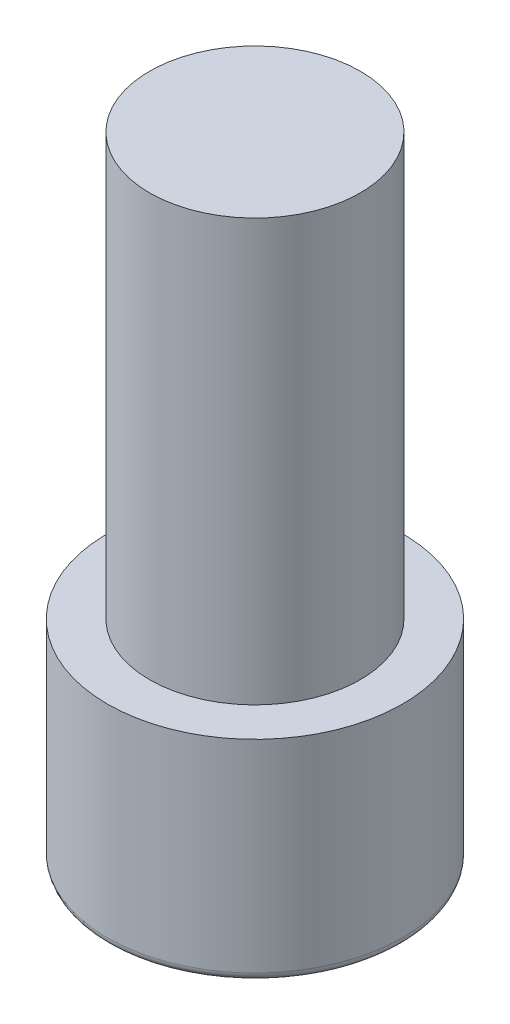
ISO-10303-21;
HEADER;
FILE_DESCRIPTION(('STEP AP214'),'2;1');
FILE_NAME('part.step','',(''),(''),'','','');
FILE_SCHEMA(('AUTOMOTIVE_DESIGN { 1 0 10303 214 1 1 1 1 }'));
ENDSEC;
DATA;
#1=APPLICATION_CONTEXT('core data for automotive mechanical design processes');
#2=APPLICATION_PROTOCOL_DEFINITION('international standard','automotive_design',2000,#1);
#3=PRODUCT_CONTEXT('',#1,'mechanical');
#4=PRODUCT('Part','Part','',(#3));
#5=PRODUCT_RELATED_PRODUCT_CATEGORY('part','',(#4));
#6=PRODUCT_DEFINITION_FORMATION('','',#4);
#7=PRODUCT_DEFINITION_CONTEXT('part definition',#1,'design');
#8=PRODUCT_DEFINITION('design','',#6,#7);
#9=PRODUCT_DEFINITION_SHAPE('','',#8);
#10=(LENGTH_UNIT() NAMED_UNIT(*) SI_UNIT(.MILLI.,.METRE.));
#11=(NAMED_UNIT(*) PLANE_ANGLE_UNIT() SI_UNIT($,.RADIAN.));
#12=(NAMED_UNIT(*) SI_UNIT($,.STERADIAN.) SOLID_ANGLE_UNIT());
#13=UNCERTAINTY_MEASURE_WITH_UNIT(LENGTH_MEASURE(1.E-05),#10,'distance_accuracy_value','');
#14=(GEOMETRIC_REPRESENTATION_CONTEXT(3) GLOBAL_UNCERTAINTY_ASSIGNED_CONTEXT((#13)) GLOBAL_UNIT_ASSIGNED_CONTEXT((#10,
#11,#12)) REPRESENTATION_CONTEXT('',''));
#15=CARTESIAN_POINT('',(0.,0.,0.));
#16=DIRECTION('',(0.,0.,1.));
#17=DIRECTION('',(1.,0.,0.));
#18=AXIS2_PLACEMENT_3D('',#15,#16,#17);
#19=CARTESIAN_POINT('',(0.,5.,0.));
#20=DIRECTION('',(0.,-1.,0.));
#21=DIRECTION('',(0.,0.,-1.));
#22=AXIS2_PLACEMENT_3D('',#19,#20,#21);
#23=CYLINDRICAL_SURFACE('',#22,3.5);
#24=CARTESIAN_POINT('',(0.,0.2,0.));
#25=DIRECTION('',(0.,1.,0.));
#26=DIRECTION('',(0.,0.,1.));
#27=AXIS2_PLACEMENT_3D('',#24,#25,#26);
#28=CIRCLE('',#27,3.5);
#29=CARTESIAN_POINT('',(0.,0.2,3.5));
#30=VERTEX_POINT('',#29);
#31=EDGE_CURVE('E50',#30,#30,#28,.T.);
#32=ORIENTED_EDGE('',*,*,#31,.T.);
#33=EDGE_LOOP('',(#32));
#34=FACE_BOUND('',#33,.T.);
#35=CARTESIAN_POINT('',(0.,5.,0.));
#36=DIRECTION('',(0.,1.,0.));
#37=DIRECTION('',(0.,0.,1.));
#38=AXIS2_PLACEMENT_3D('',#35,#36,#37);
#39=CIRCLE('',#38,3.5);
#40=CARTESIAN_POINT('',(0.,5.,3.5));
#41=VERTEX_POINT('',#40);
#42=EDGE_CURVE('E174',#41,#41,#39,.T.);
#43=ORIENTED_EDGE('',*,*,#42,.F.);
#44=EDGE_LOOP('',(#43));
#45=FACE_BOUND('',#44,.T.);
#46=ADVANCED_FACE('F41',(#34,#45),#23,.T.);
#47=CARTESIAN_POINT('',(0.,5.,0.));
#48=DIRECTION('',(0.,1.,0.));
#49=DIRECTION('',(0.,0.,1.));
#50=AXIS2_PLACEMENT_3D('',#47,#48,#49);
#51=PLANE('',#50);
#52=CARTESIAN_POINT('',(0.,5.,0.));
#53=DIRECTION('',(0.,1.,0.));
#54=DIRECTION('',(0.,0.,1.));
#55=AXIS2_PLACEMENT_3D('',#52,#53,#54);
#56=CIRCLE('',#55,2.5);
#57=CARTESIAN_POINT('',(0.,5.,2.5));
#58=VERTEX_POINT('',#57);
#59=EDGE_CURVE('E175',#58,#58,#56,.T.);
#60=ORIENTED_EDGE('',*,*,#59,.F.);
#61=EDGE_LOOP('',(#60));
#62=FACE_BOUND('',#61,.T.);
#63=ORIENTED_EDGE('',*,*,#42,.T.);
#64=EDGE_LOOP('',(#63));
#65=FACE_BOUND('',#64,.T.);
#66=ADVANCED_FACE('F251',(#62,#65),#51,.T.);
#67=CARTESIAN_POINT('',(0.,0.,0.));
#68=DIRECTION('',(0.,1.,0.));
#69=DIRECTION('',(0.,0.,1.));
#70=AXIS2_PLACEMENT_3D('',#67,#68,#69);
#71=PLANE('',#70);
#72=CARTESIAN_POINT('',(0.,0.,0.));
#73=DIRECTION('',(0.,1.,0.));
#74=DIRECTION('',(0.,0.,1.));
#75=AXIS2_PLACEMENT_3D('',#72,#73,#74);
#76=CIRCLE('',#75,3.3);
#77=CARTESIAN_POINT('',(0.,0.,3.3));
#78=VERTEX_POINT('',#77);
#79=EDGE_CURVE('E11',#78,#78,#76,.F.);
#80=ORIENTED_EDGE('',*,*,#79,.T.);
#81=EDGE_LOOP('',(#80));
#82=FACE_BOUND('',#81,.T.);
#83=DIRECTION('',(0.866025403784439,0.,-0.5));
#84=VECTOR('',#83,1.);
#85=CARTESIAN_POINT('',(0.991025403784438,0.,1.71650635094611));
#86=LINE('',#85,#84);
#87=CARTESIAN_POINT('',(0.,0.,2.28867513459481));
#88=VERTEX_POINT('',#87);
#89=CARTESIAN_POINT('',(1.98205080756888,0.,1.14433756729741));
#90=VERTEX_POINT('',#89);
#91=EDGE_CURVE('E186',#88,#90,#86,.T.);
#92=ORIENTED_EDGE('',*,*,#91,.T.);
#93=DIRECTION('',(0.,0.,-1.));
#94=VECTOR('',#93,1.);
#95=CARTESIAN_POINT('',(1.98205080756888,0.,0.));
#96=LINE('',#95,#94);
#97=CARTESIAN_POINT('',(1.98205080756888,0.,-1.14433756729741));
#98=VERTEX_POINT('',#97);
#99=EDGE_CURVE('E201',#90,#98,#96,.T.);
#100=ORIENTED_EDGE('',*,*,#99,.T.);
#101=DIRECTION('',(-0.866025403784439,0.,-0.5));
#102=VECTOR('',#101,1.);
#103=CARTESIAN_POINT('',(0.991025403784439,0.,-1.71650635094611));
#104=LINE('',#103,#102);
#105=CARTESIAN_POINT('',(0.,0.,-2.28867513459481));
#106=VERTEX_POINT('',#105);
#107=EDGE_CURVE('E198',#98,#106,#104,.T.);
#108=ORIENTED_EDGE('',*,*,#107,.T.);
#109=DIRECTION('',(-0.866025403784439,0.,0.5));
#110=VECTOR('',#109,1.);
#111=CARTESIAN_POINT('',(-0.991025403784439,0.,-1.71650635094611));
#112=LINE('',#111,#110);
#113=CARTESIAN_POINT('',(-1.98205080756888,0.,-1.14433756729741));
#114=VERTEX_POINT('',#113);
#115=EDGE_CURVE('E195',#106,#114,#112,.T.);
#116=ORIENTED_EDGE('',*,*,#115,.T.);
#117=DIRECTION('',(0.,0.,1.));
#118=VECTOR('',#117,1.);
#119=CARTESIAN_POINT('',(-1.98205080756888,0.,0.));
#120=LINE('',#119,#118);
#121=CARTESIAN_POINT('',(-1.98205080756888,0.,1.14433756729741));
#122=VERTEX_POINT('',#121);
#123=EDGE_CURVE('E192',#114,#122,#120,.T.);
#124=ORIENTED_EDGE('',*,*,#123,.T.);
#125=DIRECTION('',(0.866025403784439,0.,0.5));
#126=VECTOR('',#125,1.);
#127=CARTESIAN_POINT('',(-0.991025403784439,0.,1.71650635094611));
#128=LINE('',#127,#126);
#129=EDGE_CURVE('E189',#122,#88,#128,.T.);
#130=ORIENTED_EDGE('',*,*,#129,.T.);
#131=EDGE_LOOP('',(#92,#100,#108,#116,#124,#130));
#132=FACE_BOUND('',#131,.T.);
#133=ADVANCED_FACE('F256',(#82,#132),#71,.F.);
#134=CARTESIAN_POINT('',(0.,15.,0.));
#135=DIRECTION('',(0.,-1.,0.));
#136=DIRECTION('',(0.,0.,-1.));
#137=AXIS2_PLACEMENT_3D('',#134,#135,#136);
#138=CYLINDRICAL_SURFACE('',#137,2.5);
#139=CARTESIAN_POINT('',(0.,15.,0.));
#140=DIRECTION('',(0.,1.,0.));
#141=DIRECTION('',(0.,0.,1.));
#142=AXIS2_PLACEMENT_3D('',#139,#140,#141);
#143=CIRCLE('',#142,2.5);
#144=CARTESIAN_POINT('',(0.,15.,2.5));
#145=VERTEX_POINT('',#144);
#146=EDGE_CURVE('E156',#145,#145,#143,.T.);
#147=ORIENTED_EDGE('',*,*,#146,.F.);
#148=EDGE_LOOP('',(#147));
#149=FACE_BOUND('',#148,.T.);
#150=ORIENTED_EDGE('',*,*,#59,.T.);
#151=EDGE_LOOP('',(#150));
#152=FACE_BOUND('',#151,.T.);
#153=ADVANCED_FACE('F344',(#149,#152),#138,.T.);
#154=CARTESIAN_POINT('',(0.,15.,0.));
#155=DIRECTION('',(0.,1.,0.));
#156=DIRECTION('',(0.,0.,1.));
#157=AXIS2_PLACEMENT_3D('',#154,#155,#156);
#158=PLANE('',#157);
#159=ORIENTED_EDGE('',*,*,#146,.T.);
#160=EDGE_LOOP('',(#159));
#161=FACE_BOUND('',#160,.T.);
#162=ADVANCED_FACE('F330',(#161),#158,.T.);
#163=CARTESIAN_POINT('',(1.73205080756888,2.,1.));
#164=DIRECTION('',(0.5,0.,0.866025403784439));
#165=DIRECTION('',(0.866025403784439,0.,-0.5));
#166=AXIS2_PLACEMENT_3D('',#163,#164,#165);
#167=PLANE('',#166);
#168=DIRECTION('',(0.,-1.,0.));
#169=VECTOR('',#168,1.);
#170=CARTESIAN_POINT('',(1.73205080756888,2.,1.));
#171=LINE('',#170,#169);
#172=CARTESIAN_POINT('',(1.73205080756888,2.,1.));
#173=VERTEX_POINT('',#172);
#174=CARTESIAN_POINT('',(1.73205080756888,0.249999999999999,1.));
#175=VERTEX_POINT('',#174);
#176=EDGE_CURVE('E153',#173,#175,#171,.T.);
#177=ORIENTED_EDGE('',*,*,#176,.T.);
#178=DIRECTION('',(-0.866025403784439,0.,0.5));
#179=VECTOR('',#178,1.);
#180=CARTESIAN_POINT('',(1.73205080756888,0.249999999999999,1.));
#181=LINE('',#180,#179);
#182=CARTESIAN_POINT('',(0.,0.249999999999999,2.));
#183=VERTEX_POINT('',#182);
#184=EDGE_CURVE('E57',#175,#183,#181,.T.);
#185=ORIENTED_EDGE('',*,*,#184,.T.);
#186=DIRECTION('',(0.,-1.,0.));
#187=VECTOR('',#186,1.);
#188=CARTESIAN_POINT('',(0.,2.,2.));
#189=LINE('',#188,#187);
#190=CARTESIAN_POINT('',(0.,2.,2.));
#191=VERTEX_POINT('',#190);
#192=EDGE_CURVE('E112',#191,#183,#189,.T.);
#193=ORIENTED_EDGE('',*,*,#192,.F.);
#194=DIRECTION('',(-0.866025403784439,0.,0.5));
#195=VECTOR('',#194,1.);
#196=CARTESIAN_POINT('',(1.73205080756888,2.,1.));
#197=LINE('',#196,#195);
#198=EDGE_CURVE('E116',#173,#191,#197,.T.);
#199=ORIENTED_EDGE('',*,*,#198,.F.);
#200=EDGE_LOOP('',(#177,#185,#193,#199));
#201=FACE_BOUND('',#200,.T.);
#202=ADVANCED_FACE('F114',(#201),#167,.F.);
#203=CARTESIAN_POINT('',(1.73205080756888,2.,-1.));
#204=DIRECTION('',(1.,0.,0.));
#205=DIRECTION('',(0.,0.,-1.));
#206=AXIS2_PLACEMENT_3D('',#203,#204,#205);
#207=PLANE('',#206);
#208=DIRECTION('',(0.,-1.,0.));
#209=VECTOR('',#208,1.);
#210=CARTESIAN_POINT('',(1.73205080756888,2.,-1.));
#211=LINE('',#210,#209);
#212=CARTESIAN_POINT('',(1.73205080756888,2.,-1.));
#213=VERTEX_POINT('',#212);
#214=CARTESIAN_POINT('',(1.73205080756888,0.249999999999999,-1.));
#215=VERTEX_POINT('',#214);
#216=EDGE_CURVE('E157',#213,#215,#211,.T.);
#217=ORIENTED_EDGE('',*,*,#216,.T.);
#218=DIRECTION('',(0.,0.,1.));
#219=VECTOR('',#218,1.);
#220=CARTESIAN_POINT('',(1.73205080756888,0.249999999999999,-1.));
#221=LINE('',#220,#219);
#222=EDGE_CURVE('E179',#215,#175,#221,.T.);
#223=ORIENTED_EDGE('',*,*,#222,.T.);
#224=ORIENTED_EDGE('',*,*,#176,.F.);
#225=DIRECTION('',(0.,0.,1.));
#226=VECTOR('',#225,1.);
#227=CARTESIAN_POINT('',(1.73205080756888,2.,-1.));
#228=LINE('',#227,#226);
#229=EDGE_CURVE('E120',#213,#173,#228,.T.);
#230=ORIENTED_EDGE('',*,*,#229,.F.);
#231=EDGE_LOOP('',(#217,#223,#224,#230));
#232=FACE_BOUND('',#231,.T.);
#233=ADVANCED_FACE('F320',(#232),#207,.F.);
#234=CARTESIAN_POINT('',(0.,2.,-2.));
#235=DIRECTION('',(0.5,0.,-0.866025403784439));
#236=DIRECTION('',(-0.866025403784439,0.,-0.5));
#237=AXIS2_PLACEMENT_3D('',#234,#235,#236);
#238=PLANE('',#237);
#239=DIRECTION('',(0.,-1.,0.));
#240=VECTOR('',#239,1.);
#241=CARTESIAN_POINT('',(0.,2.,-2.));
#242=LINE('',#241,#240);
#243=CARTESIAN_POINT('',(0.,2.,-2.));
#244=VERTEX_POINT('',#243);
#245=CARTESIAN_POINT('',(0.,0.249999999999999,-2.));
#246=VERTEX_POINT('',#245);
#247=EDGE_CURVE('E161',#244,#246,#242,.T.);
#248=ORIENTED_EDGE('',*,*,#247,.T.);
#249=DIRECTION('',(0.866025403784439,0.,0.5));
#250=VECTOR('',#249,1.);
#251=CARTESIAN_POINT('',(0.,0.249999999999999,-2.));
#252=LINE('',#251,#250);
#253=EDGE_CURVE('E205',#246,#215,#252,.T.);
#254=ORIENTED_EDGE('',*,*,#253,.T.);
#255=ORIENTED_EDGE('',*,*,#216,.F.);
#256=DIRECTION('',(0.866025403784439,0.,0.5));
#257=VECTOR('',#256,1.);
#258=CARTESIAN_POINT('',(0.,2.,-2.));
#259=LINE('',#258,#257);
#260=EDGE_CURVE('E148',#244,#213,#259,.T.);
#261=ORIENTED_EDGE('',*,*,#260,.F.);
#262=EDGE_LOOP('',(#248,#254,#255,#261));
#263=FACE_BOUND('',#262,.T.);
#264=ADVANCED_FACE('F317',(#263),#238,.F.);
#265=CARTESIAN_POINT('',(-1.73205080756888,2.,-1.));
#266=DIRECTION('',(-0.5,0.,-0.866025403784439));
#267=DIRECTION('',(-0.866025403784439,0.,0.5));
#268=AXIS2_PLACEMENT_3D('',#265,#266,#267);
#269=PLANE('',#268);
#270=DIRECTION('',(0.,-1.,0.));
#271=VECTOR('',#270,1.);
#272=CARTESIAN_POINT('',(-1.73205080756888,2.,-1.));
#273=LINE('',#272,#271);
#274=CARTESIAN_POINT('',(-1.73205080756888,2.,-1.));
#275=VERTEX_POINT('',#274);
#276=CARTESIAN_POINT('',(-1.73205080756888,0.249999999999999,-1.));
#277=VERTEX_POINT('',#276);
#278=EDGE_CURVE('E165',#275,#277,#273,.T.);
#279=ORIENTED_EDGE('',*,*,#278,.T.);
#280=DIRECTION('',(0.866025403784439,0.,-0.5));
#281=VECTOR('',#280,1.);
#282=CARTESIAN_POINT('',(-1.73205080756888,0.249999999999999,-1.));
#283=LINE('',#282,#281);
#284=EDGE_CURVE('E208',#277,#246,#283,.T.);
#285=ORIENTED_EDGE('',*,*,#284,.T.);
#286=ORIENTED_EDGE('',*,*,#247,.F.);
#287=DIRECTION('',(0.866025403784439,0.,-0.5));
#288=VECTOR('',#287,1.);
#289=CARTESIAN_POINT('',(-1.73205080756888,2.,-1.));
#290=LINE('',#289,#288);
#291=EDGE_CURVE('E144',#275,#244,#290,.T.);
#292=ORIENTED_EDGE('',*,*,#291,.F.);
#293=EDGE_LOOP('',(#279,#285,#286,#292));
#294=FACE_BOUND('',#293,.T.);
#295=ADVANCED_FACE('F328',(#294),#269,.F.);
#296=CARTESIAN_POINT('',(-1.73205080756888,2.,1.));
#297=DIRECTION('',(-1.,0.,0.));
#298=DIRECTION('',(0.,0.,1.));
#299=AXIS2_PLACEMENT_3D('',#296,#297,#298);
#300=PLANE('',#299);
#301=DIRECTION('',(0.,-1.,0.));
#302=VECTOR('',#301,1.);
#303=CARTESIAN_POINT('',(-1.73205080756888,2.,1.));
#304=LINE('',#303,#302);
#305=CARTESIAN_POINT('',(-1.73205080756888,2.,1.));
#306=VERTEX_POINT('',#305);
#307=CARTESIAN_POINT('',(-1.73205080756888,0.249999999999999,1.));
#308=VERTEX_POINT('',#307);
#309=EDGE_CURVE('E119',#306,#308,#304,.T.);
#310=ORIENTED_EDGE('',*,*,#309,.T.);
#311=DIRECTION('',(0.,0.,-1.));
#312=VECTOR('',#311,1.);
#313=CARTESIAN_POINT('',(-1.73205080756888,0.249999999999999,1.));
#314=LINE('',#313,#312);
#315=EDGE_CURVE('E211',#308,#277,#314,.T.);
#316=ORIENTED_EDGE('',*,*,#315,.T.);
#317=ORIENTED_EDGE('',*,*,#278,.F.);
#318=DIRECTION('',(0.,0.,-1.));
#319=VECTOR('',#318,1.);
#320=CARTESIAN_POINT('',(-1.73205080756888,2.,1.));
#321=LINE('',#320,#319);
#322=EDGE_CURVE('E129',#306,#275,#321,.T.);
#323=ORIENTED_EDGE('',*,*,#322,.F.);
#324=EDGE_LOOP('',(#310,#316,#317,#323));
#325=FACE_BOUND('',#324,.T.);
#326=ADVANCED_FACE('F335',(#325),#300,.F.);
#327=CARTESIAN_POINT('',(0.,2.,2.));
#328=DIRECTION('',(-0.5,0.,0.866025403784439));
#329=DIRECTION('',(0.866025403784439,0.,0.5));
#330=AXIS2_PLACEMENT_3D('',#327,#328,#329);
#331=PLANE('',#330);
#332=ORIENTED_EDGE('',*,*,#192,.T.);
#333=DIRECTION('',(-0.866025403784439,0.,-0.5));
#334=VECTOR('',#333,1.);
#335=CARTESIAN_POINT('',(0.,0.249999999999999,2.));
#336=LINE('',#335,#334);
#337=EDGE_CURVE('E64',#183,#308,#336,.T.);
#338=ORIENTED_EDGE('',*,*,#337,.T.);
#339=ORIENTED_EDGE('',*,*,#309,.F.);
#340=DIRECTION('',(-0.866025403784439,0.,-0.5));
#341=VECTOR('',#340,1.);
#342=CARTESIAN_POINT('',(0.,2.,2.));
#343=LINE('',#342,#341);
#344=EDGE_CURVE('E123',#191,#306,#343,.T.);
#345=ORIENTED_EDGE('',*,*,#344,.F.);
#346=EDGE_LOOP('',(#332,#338,#339,#345));
#347=FACE_BOUND('',#346,.T.);
#348=ADVANCED_FACE('F124',(#347),#331,.F.);
#349=CARTESIAN_POINT('',(0.,2.,0.));
#350=DIRECTION('',(0.,-1.,0.));
#351=DIRECTION('',(0.,0.,-1.));
#352=AXIS2_PLACEMENT_3D('',#349,#350,#351);
#353=PLANE('',#352);
#354=ORIENTED_EDGE('',*,*,#198,.T.);
#355=ORIENTED_EDGE('',*,*,#344,.T.);
#356=ORIENTED_EDGE('',*,*,#322,.T.);
#357=ORIENTED_EDGE('',*,*,#291,.T.);
#358=ORIENTED_EDGE('',*,*,#260,.T.);
#359=ORIENTED_EDGE('',*,*,#229,.T.);
#360=EDGE_LOOP('',(#354,#355,#356,#357,#358,#359));
#361=FACE_BOUND('',#360,.T.);
#362=ADVANCED_FACE('F131',(#361),#353,.T.);
#363=CARTESIAN_POINT('',(-1.73205080756888,0.249999999999999,1.));
#364=DIRECTION('',(-0.707106781186547,0.707106781186548,0.));
#365=DIRECTION('',(0.,0.,-1.));
#366=AXIS2_PLACEMENT_3D('',#363,#364,#365);
#367=PLANE('',#366);
#368=DIRECTION('',(0.654653670707977,0.654653670707976,-0.377964473009228));
#369=VECTOR('',#368,1.);
#370=CARTESIAN_POINT('',(-1.73205080756888,0.249999999999999,1.));
#371=LINE('',#370,#369);
#372=EDGE_CURVE('E139',#122,#308,#371,.T.);
#373=ORIENTED_EDGE('',*,*,#372,.F.);
#374=ORIENTED_EDGE('',*,*,#123,.F.);
#375=DIRECTION('',(0.654653670707977,0.654653670707976,0.377964473009228));
#376=VECTOR('',#375,1.);
#377=CARTESIAN_POINT('',(-1.73205080756888,0.249999999999999,-1.));
#378=LINE('',#377,#376);
#379=EDGE_CURVE('E135',#277,#114,#378,.F.);
#380=ORIENTED_EDGE('',*,*,#379,.F.);
#381=ORIENTED_EDGE('',*,*,#315,.F.);
#382=EDGE_LOOP('',(#373,#374,#380,#381));
#383=FACE_BOUND('',#382,.T.);
#384=ADVANCED_FACE('F290',(#383),#367,.F.);
#385=CARTESIAN_POINT('',(-1.73205080756888,0.249999999999999,-1.));
#386=DIRECTION('',(-0.353553390593273,0.707106781186549,-0.612372435695794));
#387=DIRECTION('',(0.866025403784439,0.,-0.5));
#388=AXIS2_PLACEMENT_3D('',#385,#386,#387);
#389=PLANE('',#388);
#390=ORIENTED_EDGE('',*,*,#379,.T.);
#391=ORIENTED_EDGE('',*,*,#115,.F.);
#392=DIRECTION('',(0.,0.654653670707976,0.755928946018455));
#393=VECTOR('',#392,1.);
#394=CARTESIAN_POINT('',(0.,0.249999999999999,-2.));
#395=LINE('',#394,#393);
#396=EDGE_CURVE('E228',#246,#106,#395,.F.);
#397=ORIENTED_EDGE('',*,*,#396,.F.);
#398=ORIENTED_EDGE('',*,*,#284,.F.);
#399=EDGE_LOOP('',(#390,#391,#397,#398));
#400=FACE_BOUND('',#399,.T.);
#401=ADVANCED_FACE('F284',(#400),#389,.F.);
#402=CARTESIAN_POINT('',(0.,0.249999999999999,2.));
#403=DIRECTION('',(-0.353553390593273,0.707106781186548,0.612372435695794));
#404=DIRECTION('',(-0.866025403784439,0.,-0.5));
#405=AXIS2_PLACEMENT_3D('',#402,#403,#404);
#406=PLANE('',#405);
#407=ORIENTED_EDGE('',*,*,#372,.T.);
#408=ORIENTED_EDGE('',*,*,#337,.F.);
#409=DIRECTION('',(0.,0.654653670707977,-0.755928946018455));
#410=VECTOR('',#409,1.);
#411=CARTESIAN_POINT('',(0.,0.249999999999999,2.));
#412=LINE('',#411,#410);
#413=EDGE_CURVE('E224',#88,#183,#412,.T.);
#414=ORIENTED_EDGE('',*,*,#413,.F.);
#415=ORIENTED_EDGE('',*,*,#129,.F.);
#416=EDGE_LOOP('',(#407,#408,#414,#415));
#417=FACE_BOUND('',#416,.T.);
#418=ADVANCED_FACE('F277',(#417),#406,.F.);
#419=CARTESIAN_POINT('',(0.,0.249999999999999,-2.));
#420=DIRECTION('',(0.353553390593273,0.707106781186548,-0.612372435695794));
#421=DIRECTION('',(0.866025403784439,0.,0.5));
#422=AXIS2_PLACEMENT_3D('',#419,#420,#421);
#423=PLANE('',#422);
#424=ORIENTED_EDGE('',*,*,#396,.T.);
#425=ORIENTED_EDGE('',*,*,#107,.F.);
#426=DIRECTION('',(-0.654653670707978,0.654653670707976,0.377964473009228));
#427=VECTOR('',#426,1.);
#428=CARTESIAN_POINT('',(1.73205080756888,0.249999999999999,-1.));
#429=LINE('',#428,#427);
#430=EDGE_CURVE('E221',#215,#98,#429,.F.);
#431=ORIENTED_EDGE('',*,*,#430,.F.);
#432=ORIENTED_EDGE('',*,*,#253,.F.);
#433=EDGE_LOOP('',(#424,#425,#431,#432));
#434=FACE_BOUND('',#433,.T.);
#435=ADVANCED_FACE('F270',(#434),#423,.F.);
#436=CARTESIAN_POINT('',(1.73205080756888,0.249999999999999,1.));
#437=DIRECTION('',(0.353553390593274,0.707106781186548,0.612372435695795));
#438=DIRECTION('',(-0.866025403784439,0.,0.5));
#439=AXIS2_PLACEMENT_3D('',#436,#437,#438);
#440=PLANE('',#439);
#441=ORIENTED_EDGE('',*,*,#413,.T.);
#442=ORIENTED_EDGE('',*,*,#184,.F.);
#443=DIRECTION('',(0.654653670707978,-0.654653670707977,0.377964473009227));
#444=VECTOR('',#443,1.);
#445=CARTESIAN_POINT('',(1.23717914826348,0.744871659305391,0.714285714285716));
#446=LINE('',#445,#444);
#447=EDGE_CURVE('E218',#90,#175,#446,.F.);
#448=ORIENTED_EDGE('',*,*,#447,.F.);
#449=ORIENTED_EDGE('',*,*,#91,.F.);
#450=EDGE_LOOP('',(#441,#442,#448,#449));
#451=FACE_BOUND('',#450,.T.);
#452=ADVANCED_FACE('F246',(#451),#440,.F.);
#453=CARTESIAN_POINT('',(1.73205080756888,0.249999999999999,-1.));
#454=DIRECTION('',(0.707106781186547,0.707106781186548,0.));
#455=DIRECTION('',(0.,0.,1.));
#456=AXIS2_PLACEMENT_3D('',#453,#454,#455);
#457=PLANE('',#456);
#458=ORIENTED_EDGE('',*,*,#430,.T.);
#459=ORIENTED_EDGE('',*,*,#99,.F.);
#460=ORIENTED_EDGE('',*,*,#447,.T.);
#461=ORIENTED_EDGE('',*,*,#222,.F.);
#462=EDGE_LOOP('',(#458,#459,#460,#461));
#463=FACE_BOUND('',#462,.T.);
#464=ADVANCED_FACE('F241',(#463),#457,.F.);
#465=CARTESIAN_POINT('',(0.,0.2,0.));
#466=DIRECTION('',(0.,1.,0.));
#467=DIRECTION('',(0.,0.,1.));
#468=AXIS2_PLACEMENT_3D('',#465,#466,#467);
#469=TOROIDAL_SURFACE('',#468,3.3,0.2);
#470=ORIENTED_EDGE('',*,*,#79,.F.);
#471=EDGE_LOOP('',(#470));
#472=FACE_BOUND('',#471,.T.);
#473=ORIENTED_EDGE('',*,*,#31,.F.);
#474=EDGE_LOOP('',(#473));
#475=FACE_BOUND('',#474,.T.);
#476=ADVANCED_FACE('F43',(#472,#475),#469,.T.);
#477=CLOSED_SHELL('',(#46,#66,#133,#153,#162,#202,#233,#264,#295,#326,#348,#362,#384,#401,#418,
#435,#452,#464,#476));
#478=MANIFOLD_SOLID_BREP('B2',#477);
#479=ADVANCED_BREP_SHAPE_REPRESENTATION('',(#18,#478),#14);
#480=SHAPE_DEFINITION_REPRESENTATION(#9,#479);
ENDSEC;
END-ISO-10303-21;
